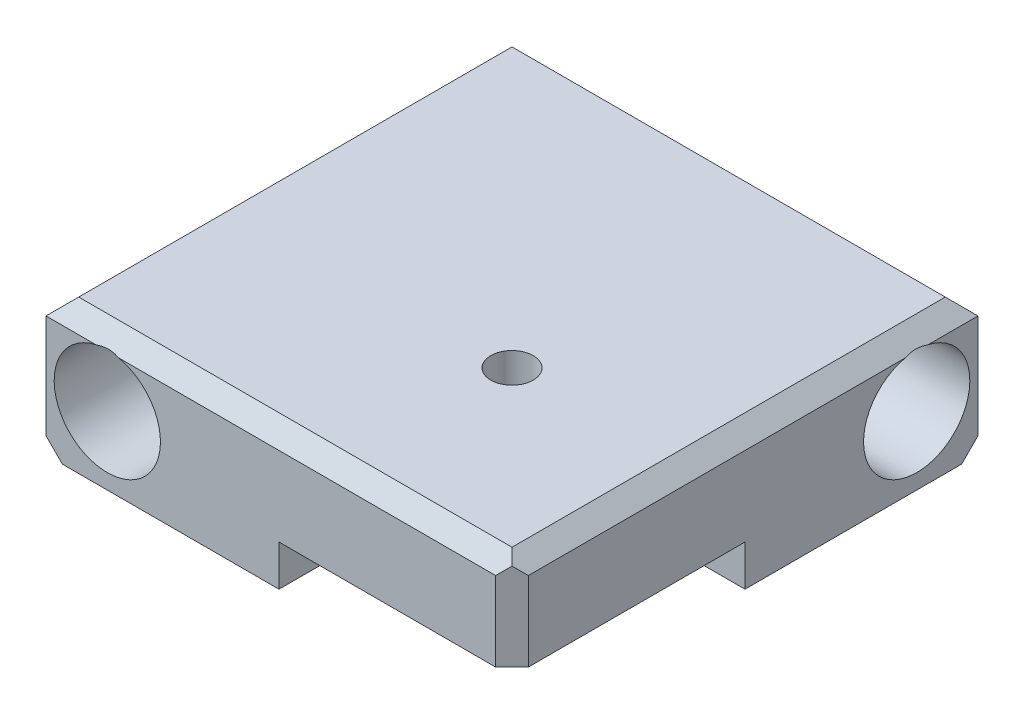
ISO-10303-21;
HEADER;
FILE_DESCRIPTION(('STEP AP214'),'2;1');
FILE_NAME('part.step','',(''),(''),'','','');
FILE_SCHEMA(('AUTOMOTIVE_DESIGN { 1 0 10303 214 1 1 1 1 }'));
ENDSEC;
DATA;
#1=APPLICATION_CONTEXT('core data for automotive mechanical design processes');
#2=APPLICATION_PROTOCOL_DEFINITION('international standard','automotive_design',2000,#1);
#3=PRODUCT_CONTEXT('',#1,'mechanical');
#4=PRODUCT('Part','Part','',(#3));
#5=PRODUCT_RELATED_PRODUCT_CATEGORY('part','',(#4));
#6=PRODUCT_DEFINITION_FORMATION('','',#4);
#7=PRODUCT_DEFINITION_CONTEXT('part definition',#1,'design');
#8=PRODUCT_DEFINITION('design','',#6,#7);
#9=PRODUCT_DEFINITION_SHAPE('','',#8);
#10=(LENGTH_UNIT() NAMED_UNIT(*) SI_UNIT(.MILLI.,.METRE.));
#11=(NAMED_UNIT(*) PLANE_ANGLE_UNIT() SI_UNIT($,.RADIAN.));
#12=(NAMED_UNIT(*) SI_UNIT($,.STERADIAN.) SOLID_ANGLE_UNIT());
#13=UNCERTAINTY_MEASURE_WITH_UNIT(LENGTH_MEASURE(1.E-05),#10,'distance_accuracy_value','');
#14=(GEOMETRIC_REPRESENTATION_CONTEXT(3) GLOBAL_UNCERTAINTY_ASSIGNED_CONTEXT((#13)) GLOBAL_UNIT_ASSIGNED_CONTEXT((#10,
#11,#12)) REPRESENTATION_CONTEXT('',''));
#15=CARTESIAN_POINT('',(0.,0.,0.));
#16=DIRECTION('',(0.,0.,1.));
#17=DIRECTION('',(1.,0.,0.));
#18=AXIS2_PLACEMENT_3D('',#15,#16,#17);
#19=CARTESIAN_POINT('',(28.5,-59.39696961967,16.));
#20=DIRECTION('',(0.,1.,0.));
#21=DIRECTION('',(0.,0.,1.));
#22=AXIS2_PLACEMENT_3D('',#19,#20,#21);
#23=CYLINDRICAL_SURFACE('',#22,2.6);
#24=CARTESIAN_POINT('',(28.5,16.7,16.));
#25=DIRECTION('',(0.,1.,0.));
#26=DIRECTION('',(0.,0.,1.));
#27=AXIS2_PLACEMENT_3D('',#24,#25,#26);
#28=CIRCLE('',#27,2.6);
#29=CARTESIAN_POINT('',(28.5,16.7,18.6));
#30=VERTEX_POINT('',#29);
#31=EDGE_CURVE('E244',#30,#30,#28,.T.);
#32=ORIENTED_EDGE('',*,*,#31,.T.);
#33=EDGE_LOOP('',(#32));
#34=FACE_BOUND('',#33,.T.);
#35=CARTESIAN_POINT('',(28.5,5.,16.));
#36=DIRECTION('',(0.,-1.,0.));
#37=DIRECTION('',(0.,0.,-1.));
#38=AXIS2_PLACEMENT_3D('',#35,#36,#37);
#39=CIRCLE('',#38,2.6);
#40=CARTESIAN_POINT('',(28.5,5.,13.4));
#41=VERTEX_POINT('',#40);
#42=EDGE_CURVE('E222',#41,#41,#39,.F.);
#43=ORIENTED_EDGE('',*,*,#42,.F.);
#44=EDGE_LOOP('',(#43));
#45=FACE_BOUND('',#44,.T.);
#46=ADVANCED_FACE('F55',(#34,#45),#23,.F.);
#47=CARTESIAN_POINT('',(47.5,-59.39696961967,37.));
#48=DIRECTION('',(-0.707106781186547,0.,-0.707106781186547));
#49=DIRECTION('',(0.,1.,0.));
#50=AXIS2_PLACEMENT_3D('',#47,#48,#49);
#51=PLANE('',#50);
#52=DIRECTION('',(0.,-1.,0.));
#53=VECTOR('',#52,1.);
#54=CARTESIAN_POINT('',(49.5,-59.39696961967,35.));
#55=LINE('',#54,#53);
#56=CARTESIAN_POINT('',(49.5,14.7,35.));
#57=VERTEX_POINT('',#56);
#58=CARTESIAN_POINT('',(49.5,5.,35.));
#59=VERTEX_POINT('',#58);
#60=EDGE_CURVE('E317',#57,#59,#55,.T.);
#61=ORIENTED_EDGE('',*,*,#60,.F.);
#62=DIRECTION('',(-0.577350269189625,0.577350269189627,0.577350269189625));
#63=VECTOR('',#62,1.);
#64=CARTESIAN_POINT('',(72.86565653989,-8.66565653989013,11.63434346011));
#65=LINE('',#64,#63);
#66=CARTESIAN_POINT('',(48.5,15.7,36.));
#67=VERTEX_POINT('',#66);
#68=EDGE_CURVE('E334',#57,#67,#65,.T.);
#69=ORIENTED_EDGE('',*,*,#68,.T.);
#70=DIRECTION('',(-0.577350269189625,-0.577350269189627,0.577350269189625));
#71=VECTOR('',#70,1.);
#72=CARTESIAN_POINT('',(22.8010101267766,-9.99898987322346,61.6989898732234));
#73=LINE('',#72,#71);
#74=CARTESIAN_POINT('',(47.5,14.7,37.));
#75=VERTEX_POINT('',#74);
#76=EDGE_CURVE('E332',#67,#75,#73,.T.);
#77=ORIENTED_EDGE('',*,*,#76,.T.);
#78=DIRECTION('',(0.,1.,0.));
#79=VECTOR('',#78,1.);
#80=CARTESIAN_POINT('',(47.5,-59.39696961967,37.));
#81=LINE('',#80,#79);
#82=CARTESIAN_POINT('',(47.5,5.,37.));
#83=VERTEX_POINT('',#82);
#84=EDGE_CURVE('E298',#83,#75,#81,.T.);
#85=ORIENTED_EDGE('',*,*,#84,.F.);
#86=DIRECTION('',(-0.707106781186547,0.,0.707106781186547));
#87=VECTOR('',#86,1.);
#88=CARTESIAN_POINT('',(49.5,5.,35.));
#89=LINE('',#88,#87);
#90=EDGE_CURVE('E213',#59,#83,#89,.T.);
#91=ORIENTED_EDGE('',*,*,#90,.F.);
#92=EDGE_LOOP('',(#61,#69,#77,#85,#91));
#93=FACE_BOUND('',#92,.T.);
#94=ADVANCED_FACE('F412',(#93),#51,.F.);
#95=CARTESIAN_POINT('',(0.,0.,0.));
#96=DIRECTION('',(0.,1.,0.));
#97=DIRECTION('',(0.,0.,1.));
#98=AXIS2_PLACEMENT_3D('',#95,#96,#97);
#99=PLANE('',#98);
#100=CARTESIAN_POINT('',(28.5,0.,16.));
#101=DIRECTION('',(0.,-1.,0.));
#102=DIRECTION('',(0.,0.,-1.));
#103=AXIS2_PLACEMENT_3D('',#100,#101,#102);
#104=CIRCLE('',#103,7.5);
#105=CARTESIAN_POINT('',(21.,0.,16.));
#106=VERTEX_POINT('',#105);
#107=CARTESIAN_POINT('',(28.5,0.,8.50000000000001));
#108=VERTEX_POINT('',#107);
#109=EDGE_CURVE('E188',#106,#108,#104,.T.);
#110=ORIENTED_EDGE('',*,*,#109,.F.);
#111=DIRECTION('',(0.,0.,-1.));
#112=VECTOR('',#111,1.);
#113=CARTESIAN_POINT('',(21.,0.,37.));
#114=LINE('',#113,#112);
#115=CARTESIAN_POINT('',(21.,0.,37.));
#116=VERTEX_POINT('',#115);
#117=EDGE_CURVE('E206',#116,#106,#114,.T.);
#118=ORIENTED_EDGE('',*,*,#117,.F.);
#119=DIRECTION('',(-1.,0.,0.));
#120=VECTOR('',#119,1.);
#121=CARTESIAN_POINT('',(0.,0.,37.));
#122=LINE('',#121,#120);
#123=CARTESIAN_POINT('',(-5.5,0.,37.));
#124=VERTEX_POINT('',#123);
#125=EDGE_CURVE('E248',#116,#124,#122,.T.);
#126=ORIENTED_EDGE('',*,*,#125,.T.);
#127=DIRECTION('',(0.,0.,-1.));
#128=VECTOR('',#127,1.);
#129=CARTESIAN_POINT('',(-5.49999999999999,0.,-20.));
#130=LINE('',#129,#128);
#131=CARTESIAN_POINT('',(-5.49999999999999,0.,-9.03589838486224));
#132=VERTEX_POINT('',#131);
#133=EDGE_CURVE('E273',#124,#132,#130,.T.);
#134=ORIENTED_EDGE('',*,*,#133,.T.);
#135=CARTESIAN_POINT('',(0.,0.,-12.5));
#136=DIRECTION('',(0.,-1.,0.));
#137=DIRECTION('',(0.,0.,-1.));
#138=AXIS2_PLACEMENT_3D('',#135,#136,#137);
#139=CIRCLE('',#138,6.5);
#140=CARTESIAN_POINT('',(3.46410161513776,0.,-18.));
#141=VERTEX_POINT('',#140);
#142=EDGE_CURVE('E254',#141,#132,#139,.T.);
#143=ORIENTED_EDGE('',*,*,#142,.F.);
#144=DIRECTION('',(1.,0.,0.));
#145=VECTOR('',#144,1.);
#146=CARTESIAN_POINT('',(17.5,0.,-18.));
#147=LINE('',#146,#145);
#148=CARTESIAN_POINT('',(49.5,0.,-18.));
#149=VERTEX_POINT('',#148);
#150=EDGE_CURVE('E267',#141,#149,#147,.T.);
#151=ORIENTED_EDGE('',*,*,#150,.T.);
#152=DIRECTION('',(0.,0.,1.));
#153=VECTOR('',#152,1.);
#154=CARTESIAN_POINT('',(49.5,0.,0.));
#155=LINE('',#154,#153);
#156=CARTESIAN_POINT('',(49.5,0.,8.50000000000001));
#157=VERTEX_POINT('',#156);
#158=EDGE_CURVE('E249',#149,#157,#155,.T.);
#159=ORIENTED_EDGE('',*,*,#158,.T.);
#160=DIRECTION('',(1.,0.,0.));
#161=VECTOR('',#160,1.);
#162=CARTESIAN_POINT('',(28.5,0.,8.50000000000001));
#163=LINE('',#162,#161);
#164=EDGE_CURVE('E209',#108,#157,#163,.T.);
#165=ORIENTED_EDGE('',*,*,#164,.F.);
#166=EDGE_LOOP('',(#110,#118,#126,#134,#143,#151,#159,#165));
#167=FACE_BOUND('',#166,.T.);
#168=ADVANCED_FACE('F398',(#167),#99,.F.);
#169=CARTESIAN_POINT('',(-7.5,16.7,0.));
#170=DIRECTION('',(-1.,0.,0.));
#171=DIRECTION('',(0.,0.,1.));
#172=AXIS2_PLACEMENT_3D('',#169,#170,#171);
#173=PLANE('',#172);
#174=DIRECTION('',(0.,-1.,0.));
#175=VECTOR('',#174,1.);
#176=CARTESIAN_POINT('',(-7.49999999999999,16.7,-18.));
#177=LINE('',#176,#175);
#178=CARTESIAN_POINT('',(-7.49999999999999,14.7,-18.));
#179=VERTEX_POINT('',#178);
#180=CARTESIAN_POINT('',(-7.49999999999999,2.,-18.));
#181=VERTEX_POINT('',#180);
#182=EDGE_CURVE('E280',#179,#181,#177,.T.);
#183=ORIENTED_EDGE('',*,*,#182,.T.);
#184=DIRECTION('',(0.,0.,1.));
#185=VECTOR('',#184,1.);
#186=CARTESIAN_POINT('',(-7.5,2.,5.));
#187=LINE('',#186,#185);
#188=CARTESIAN_POINT('',(-7.5,2.,37.));
#189=VERTEX_POINT('',#188);
#190=EDGE_CURVE('E284',#181,#189,#187,.T.);
#191=ORIENTED_EDGE('',*,*,#190,.T.);
#192=DIRECTION('',(0.,-1.,0.));
#193=VECTOR('',#192,1.);
#194=CARTESIAN_POINT('',(-7.5,14.7,37.));
#195=LINE('',#194,#193);
#196=CARTESIAN_POINT('',(-7.5,14.7,37.));
#197=VERTEX_POINT('',#196);
#198=EDGE_CURVE('E241',#197,#189,#195,.T.);
#199=ORIENTED_EDGE('',*,*,#198,.F.);
#200=DIRECTION('',(0.,0.,-1.));
#201=VECTOR('',#200,1.);
#202=CARTESIAN_POINT('',(-7.5,14.7,0.));
#203=LINE('',#202,#201);
#204=EDGE_CURVE('E282',#197,#179,#203,.T.);
#205=ORIENTED_EDGE('',*,*,#204,.T.);
#206=EDGE_LOOP('',(#183,#191,#199,#205));
#207=FACE_BOUND('',#206,.T.);
#208=ADVANCED_FACE('F351',(#207),#173,.T.);
#209=CARTESIAN_POINT('',(0.,16.7,-20.));
#210=DIRECTION('',(0.,0.,-1.));
#211=DIRECTION('',(-1.,0.,0.));
#212=AXIS2_PLACEMENT_3D('',#209,#210,#211);
#213=PLANE('',#212);
#214=DIRECTION('',(0.,1.,0.));
#215=VECTOR('',#214,1.);
#216=CARTESIAN_POINT('',(-5.49999999999999,16.7,-20.));
#217=LINE('',#216,#215);
#218=CARTESIAN_POINT('',(-5.49999999999999,2.,-20.));
#219=VERTEX_POINT('',#218);
#220=CARTESIAN_POINT('',(-5.49999999999999,14.7,-20.));
#221=VERTEX_POINT('',#220);
#222=EDGE_CURVE('E291',#219,#221,#217,.T.);
#223=ORIENTED_EDGE('',*,*,#222,.T.);
#224=DIRECTION('',(1.,0.,0.));
#225=VECTOR('',#224,1.);
#226=CARTESIAN_POINT('',(0.,14.7,-20.));
#227=LINE('',#226,#225);
#228=CARTESIAN_POINT('',(49.5,14.7,-20.));
#229=VERTEX_POINT('',#228);
#230=EDGE_CURVE('E295',#221,#229,#227,.T.);
#231=ORIENTED_EDGE('',*,*,#230,.T.);
#232=DIRECTION('',(0.,1.,0.));
#233=VECTOR('',#232,1.);
#234=CARTESIAN_POINT('',(49.5,2.,-20.));
#235=LINE('',#234,#233);
#236=CARTESIAN_POINT('',(49.5,2.,-20.));
#237=VERTEX_POINT('',#236);
#238=EDGE_CURVE('E229',#237,#229,#235,.T.);
#239=ORIENTED_EDGE('',*,*,#238,.F.);
#240=DIRECTION('',(-1.,0.,0.));
#241=VECTOR('',#240,1.);
#242=CARTESIAN_POINT('',(-7.5,2.,-20.));
#243=LINE('',#242,#241);
#244=EDGE_CURVE('E293',#237,#219,#243,.T.);
#245=ORIENTED_EDGE('',*,*,#244,.T.);
#246=EDGE_LOOP('',(#223,#231,#239,#245));
#247=FACE_BOUND('',#246,.T.);
#248=ADVANCED_FACE('F420',(#247),#213,.T.);
#249=CARTESIAN_POINT('',(0.,16.7,0.));
#250=DIRECTION('',(0.,1.,0.));
#251=DIRECTION('',(0.,0.,1.));
#252=AXIS2_PLACEMENT_3D('',#249,#250,#251);
#253=PLANE('',#252);
#254=DIRECTION('',(1.,0.,0.));
#255=VECTOR('',#254,1.);
#256=CARTESIAN_POINT('',(0.,16.7,35.));
#257=LINE('',#256,#255);
#258=CARTESIAN_POINT('',(-5.5,16.7,35.));
#259=VERTEX_POINT('',#258);
#260=CARTESIAN_POINT('',(47.5,16.7,35.));
#261=VERTEX_POINT('',#260);
#262=EDGE_CURVE('E319',#259,#261,#257,.T.);
#263=ORIENTED_EDGE('',*,*,#262,.T.);
#264=DIRECTION('',(0.,0.,-1.));
#265=VECTOR('',#264,1.);
#266=CARTESIAN_POINT('',(47.5,16.7,0.));
#267=LINE('',#266,#265);
#268=CARTESIAN_POINT('',(47.5,16.7,-18.));
#269=VERTEX_POINT('',#268);
#270=EDGE_CURVE('E321',#261,#269,#267,.T.);
#271=ORIENTED_EDGE('',*,*,#270,.T.);
#272=DIRECTION('',(-1.,0.,0.));
#273=VECTOR('',#272,1.);
#274=CARTESIAN_POINT('',(0.,16.7,-18.));
#275=LINE('',#274,#273);
#276=CARTESIAN_POINT('',(-5.49999999999999,16.7,-18.));
#277=VERTEX_POINT('',#276);
#278=EDGE_CURVE('E286',#269,#277,#275,.T.);
#279=ORIENTED_EDGE('',*,*,#278,.T.);
#280=DIRECTION('',(0.,0.,1.));
#281=VECTOR('',#280,1.);
#282=CARTESIAN_POINT('',(-5.49999999999999,16.7,0.));
#283=LINE('',#282,#281);
#284=EDGE_CURVE('E288',#277,#259,#283,.T.);
#285=ORIENTED_EDGE('',*,*,#284,.T.);
#286=EDGE_LOOP('',(#263,#271,#279,#285));
#287=FACE_BOUND('',#286,.T.);
#288=ORIENTED_EDGE('',*,*,#31,.F.);
#289=EDGE_LOOP('',(#288));
#290=FACE_BOUND('',#289,.T.);
#291=ADVANCED_FACE('F360',(#287,#290),#253,.T.);
#292=CARTESIAN_POINT('',(-5.49999999999999,0.,-15.9641016151378));
#293=VERTEX_POINT('',#292);
#294=CARTESIAN_POINT('',(-3.46410161513776,0.,-18.));
#295=VERTEX_POINT('',#294);
#296=EDGE_CURVE('E258',#293,#295,#139,.T.);
#297=ORIENTED_EDGE('',*,*,#296,.F.);
#298=DIRECTION('',(0.,0.,-1.));
#299=VECTOR('',#298,1.);
#300=CARTESIAN_POINT('',(-5.49999999999999,0.,-20.));
#301=LINE('',#300,#299);
#302=CARTESIAN_POINT('',(-5.49999999999999,0.,-18.));
#303=VERTEX_POINT('',#302);
#304=EDGE_CURVE('E271',#293,#303,#301,.T.);
#305=ORIENTED_EDGE('',*,*,#304,.T.);
#306=DIRECTION('',(1.,0.,0.));
#307=VECTOR('',#306,1.);
#308=CARTESIAN_POINT('',(17.5,0.,-18.));
#309=LINE('',#308,#307);
#310=EDGE_CURVE('E269',#303,#295,#309,.T.);
#311=ORIENTED_EDGE('',*,*,#310,.T.);
#312=EDGE_LOOP('',(#297,#305,#311));
#313=FACE_BOUND('',#312,.T.);
#314=ADVANCED_FACE('F392',(#313),#99,.F.);
#315=CARTESIAN_POINT('',(0.,14.7,0.));
#316=DIRECTION('',(0.,1.,0.));
#317=DIRECTION('',(0.,0.,1.));
#318=AXIS2_PLACEMENT_3D('',#315,#316,#317);
#319=PLANE('',#318);
#320=CARTESIAN_POINT('',(0.,14.7,-12.5));
#321=DIRECTION('',(0.,1.,0.));
#322=DIRECTION('',(0.,0.,1.));
#323=AXIS2_PLACEMENT_3D('',#320,#321,#322);
#324=CIRCLE('',#323,6.5);
#325=CARTESIAN_POINT('',(0.,14.7,-6.00000000000001));
#326=VERTEX_POINT('',#325);
#327=EDGE_CURVE('E257',#326,#326,#324,.F.);
#328=ORIENTED_EDGE('',*,*,#327,.T.);
#329=EDGE_LOOP('',(#328));
#330=FACE_BOUND('',#329,.T.);
#331=ADVANCED_FACE('F459',(#330),#319,.F.);
#332=CARTESIAN_POINT('',(0.,35.0847763108502,-12.5));
#333=DIRECTION('',(0.,-1.,0.));
#334=DIRECTION('',(0.,0.,-1.));
#335=AXIS2_PLACEMENT_3D('',#332,#333,#334);
#336=CYLINDRICAL_SURFACE('',#335,6.5);
#337=ORIENTED_EDGE('',*,*,#142,.T.);
#338=CARTESIAN_POINT('',(0.,-5.49999999999999,-12.5));
#339=DIRECTION('',(-0.707106781186547,-0.707106781186548,0.));
#340=DIRECTION('',(0.707106781186548,-0.707106781186547,0.));
#341=AXIS2_PLACEMENT_3D('',#338,#339,#340);
#342=ELLIPSE('',#341,9.19238815542512,6.5);
#343=EDGE_CURVE('E278',#132,#293,#342,.T.);
#344=ORIENTED_EDGE('',*,*,#343,.T.);
#345=ORIENTED_EDGE('',*,*,#296,.T.);
#346=CARTESIAN_POINT('',(0.,-5.5,-12.5));
#347=DIRECTION('',(0.,-0.707106781186547,-0.707106781186548));
#348=DIRECTION('',(0.,-0.707106781186548,0.707106781186547));
#349=AXIS2_PLACEMENT_3D('',#346,#347,#348);
#350=ELLIPSE('',#349,9.19238815542512,6.5);
#351=EDGE_CURVE('E276',#295,#141,#350,.T.);
#352=ORIENTED_EDGE('',*,*,#351,.T.);
#353=EDGE_LOOP('',(#337,#344,#345,#352));
#354=FACE_BOUND('',#353,.T.);
#355=ORIENTED_EDGE('',*,*,#327,.F.);
#356=EDGE_LOOP('',(#355));
#357=FACE_BOUND('',#356,.T.);
#358=ADVANCED_FACE('F394',(#354,#357),#336,.F.);
#359=CARTESIAN_POINT('',(0.,14.7,-20.));
#360=DIRECTION('',(0.,-0.707106781186547,0.707106781186548));
#361=DIRECTION('',(1.,0.,0.));
#362=AXIS2_PLACEMENT_3D('',#359,#360,#361);
#363=PLANE('',#362);
#364=ORIENTED_EDGE('',*,*,#278,.F.);
#365=DIRECTION('',(0.577350269189625,-0.577350269189627,-0.577350269189626));
#366=VECTOR('',#365,1.);
#367=CARTESIAN_POINT('',(33.0000000000001,31.2,-3.50000000000002));
#368=LINE('',#367,#366);
#369=EDGE_CURVE('E324',#269,#229,#368,.T.);
#370=ORIENTED_EDGE('',*,*,#369,.T.);
#371=ORIENTED_EDGE('',*,*,#230,.F.);
#372=DIRECTION('',(0.,0.707106781186548,0.707106781186547));
#373=VECTOR('',#372,1.);
#374=CARTESIAN_POINT('',(-5.49999999999999,15.7,-19.));
#375=LINE('',#374,#373);
#376=EDGE_CURVE('E313',#277,#221,#375,.F.);
#377=ORIENTED_EDGE('',*,*,#376,.F.);
#378=EDGE_LOOP('',(#364,#370,#371,#377));
#379=FACE_BOUND('',#378,.T.);
#380=ADVANCED_FACE('F366',(#379),#363,.F.);
#381=CARTESIAN_POINT('',(-7.5,14.7,0.));
#382=DIRECTION('',(0.707106781186547,-0.707106781186548,0.));
#383=DIRECTION('',(0.,0.,-1.));
#384=AXIS2_PLACEMENT_3D('',#381,#382,#383);
#385=PLANE('',#384);
#386=ORIENTED_EDGE('',*,*,#204,.F.);
#387=DIRECTION('',(0.577350269189627,0.577350269189626,-0.577350269189624));
#388=VECTOR('',#387,1.);
#389=CARTESIAN_POINT('',(4.83333333333332,27.0333333333333,24.6666666666667));
#390=LINE('',#389,#388);
#391=EDGE_CURVE('E14',#197,#259,#390,.T.);
#392=ORIENTED_EDGE('',*,*,#391,.T.);
#393=ORIENTED_EDGE('',*,*,#284,.F.);
#394=DIRECTION('',(-0.707106781186548,-0.707106781186547,0.));
#395=VECTOR('',#394,1.);
#396=CARTESIAN_POINT('',(-7.49999999999999,14.7,-18.));
#397=LINE('',#396,#395);
#398=EDGE_CURVE('E310',#179,#277,#397,.F.);
#399=ORIENTED_EDGE('',*,*,#398,.F.);
#400=EDGE_LOOP('',(#386,#392,#393,#399));
#401=FACE_BOUND('',#400,.T.);
#402=ADVANCED_FACE('F347',(#401),#385,.F.);
#403=CARTESIAN_POINT('',(-7.49999999999999,14.7,-18.));
#404=DIRECTION('',(-0.577350269189626,0.577350269189626,-0.577350269189626));
#405=DIRECTION('',(0.,0.707106781186548,0.707106781186547));
#406=AXIS2_PLACEMENT_3D('',#403,#404,#405);
#407=PLANE('',#406);
#408=ORIENTED_EDGE('',*,*,#398,.T.);
#409=ORIENTED_EDGE('',*,*,#376,.T.);
#410=DIRECTION('',(0.707106781186548,0.,-0.707106781186547));
#411=VECTOR('',#410,1.);
#412=CARTESIAN_POINT('',(-7.49999999999999,14.7,-18.));
#413=LINE('',#412,#411);
#414=EDGE_CURVE('E307',#179,#221,#413,.T.);
#415=ORIENTED_EDGE('',*,*,#414,.F.);
#416=EDGE_LOOP('',(#408,#409,#415));
#417=FACE_BOUND('',#416,.T.);
#418=ADVANCED_FACE('F368',(#417),#407,.T.);
#419=CARTESIAN_POINT('',(0.,0.,-18.));
#420=DIRECTION('',(0.,-0.707106781186547,-0.707106781186548));
#421=DIRECTION('',(-1.,0.,0.));
#422=AXIS2_PLACEMENT_3D('',#419,#420,#421);
#423=PLANE('',#422);
#424=ORIENTED_EDGE('',*,*,#351,.F.);
#425=ORIENTED_EDGE('',*,*,#310,.F.);
#426=DIRECTION('',(0.,-0.707106781186548,0.707106781186547));
#427=VECTOR('',#426,1.);
#428=CARTESIAN_POINT('',(-5.49999999999999,0.,-18.));
#429=LINE('',#428,#427);
#430=EDGE_CURVE('E304',#219,#303,#429,.T.);
#431=ORIENTED_EDGE('',*,*,#430,.F.);
#432=ORIENTED_EDGE('',*,*,#244,.F.);
#433=DIRECTION('',(0.,0.707106781186547,-0.707106781186548));
#434=VECTOR('',#433,1.);
#435=CARTESIAN_POINT('',(49.5,0.,-18.));
#436=LINE('',#435,#434);
#437=EDGE_CURVE('E232',#149,#237,#436,.T.);
#438=ORIENTED_EDGE('',*,*,#437,.F.);
#439=ORIENTED_EDGE('',*,*,#150,.F.);
#440=EDGE_LOOP('',(#424,#425,#431,#432,#438,#439));
#441=FACE_BOUND('',#440,.T.);
#442=ADVANCED_FACE('F385',(#441),#423,.T.);
#443=CARTESIAN_POINT('',(-7.49999999999999,16.7,-18.));
#444=DIRECTION('',(0.707106781186547,0.,0.707106781186548));
#445=DIRECTION('',(0.,-1.,0.));
#446=AXIS2_PLACEMENT_3D('',#443,#444,#445);
#447=PLANE('',#446);
#448=ORIENTED_EDGE('',*,*,#414,.T.);
#449=ORIENTED_EDGE('',*,*,#222,.F.);
#450=DIRECTION('',(-0.707106781186548,0.,0.707106781186547));
#451=VECTOR('',#450,1.);
#452=CARTESIAN_POINT('',(-6.49999999999999,2.,-19.));
#453=LINE('',#452,#451);
#454=EDGE_CURVE('E301',#181,#219,#453,.F.);
#455=ORIENTED_EDGE('',*,*,#454,.F.);
#456=ORIENTED_EDGE('',*,*,#182,.F.);
#457=EDGE_LOOP('',(#448,#449,#455,#456));
#458=FACE_BOUND('',#457,.T.);
#459=ADVANCED_FACE('F373',(#458),#447,.F.);
#460=CARTESIAN_POINT('',(-5.49999999999999,0.,-18.));
#461=DIRECTION('',(-0.577350269189626,-0.577350269189626,-0.577350269189626));
#462=DIRECTION('',(0.,0.707106781186548,-0.707106781186547));
#463=AXIS2_PLACEMENT_3D('',#460,#461,#462);
#464=PLANE('',#463);
#465=ORIENTED_EDGE('',*,*,#454,.T.);
#466=ORIENTED_EDGE('',*,*,#430,.T.);
#467=DIRECTION('',(-0.707106781186548,0.707106781186547,0.));
#468=VECTOR('',#467,1.);
#469=CARTESIAN_POINT('',(-5.49999999999999,0.,-18.));
#470=LINE('',#469,#468);
#471=EDGE_CURVE('E252',#181,#303,#470,.F.);
#472=ORIENTED_EDGE('',*,*,#471,.F.);
#473=EDGE_LOOP('',(#465,#466,#472));
#474=FACE_BOUND('',#473,.T.);
#475=ADVANCED_FACE('F381',(#474),#464,.T.);
#476=CARTESIAN_POINT('',(-5.49999999999999,0.,0.));
#477=DIRECTION('',(-0.707106781186547,-0.707106781186548,0.));
#478=DIRECTION('',(0.,0.,1.));
#479=AXIS2_PLACEMENT_3D('',#476,#477,#478);
#480=PLANE('',#479);
#481=ORIENTED_EDGE('',*,*,#133,.F.);
#482=DIRECTION('',(0.707106781186548,-0.707106781186547,0.));
#483=VECTOR('',#482,1.);
#484=CARTESIAN_POINT('',(-7.5,2.,37.));
#485=LINE('',#484,#483);
#486=EDGE_CURVE('E238',#189,#124,#485,.T.);
#487=ORIENTED_EDGE('',*,*,#486,.F.);
#488=ORIENTED_EDGE('',*,*,#190,.F.);
#489=ORIENTED_EDGE('',*,*,#471,.T.);
#490=ORIENTED_EDGE('',*,*,#304,.F.);
#491=ORIENTED_EDGE('',*,*,#343,.F.);
#492=EDGE_LOOP('',(#481,#487,#488,#489,#490,#491));
#493=FACE_BOUND('',#492,.T.);
#494=ADVANCED_FACE('F379',(#493),#480,.T.);
#495=CARTESIAN_POINT('',(0.,-59.39696961967,37.));
#496=DIRECTION('',(0.,0.,1.));
#497=DIRECTION('',(1.,0.,0.));
#498=AXIS2_PLACEMENT_3D('',#495,#496,#497);
#499=PLANE('',#498);
#500=ORIENTED_EDGE('',*,*,#84,.T.);
#501=DIRECTION('',(-1.,0.,0.));
#502=VECTOR('',#501,1.);
#503=CARTESIAN_POINT('',(0.,14.7,37.));
#504=LINE('',#503,#502);
#505=CARTESIAN_POINT('',(1.3883443376915,14.7,37.));
#506=VERTEX_POINT('',#505);
#507=EDGE_CURVE('E77',#75,#506,#504,.T.);
#508=ORIENTED_EDGE('',*,*,#507,.T.);
#509=CARTESIAN_POINT('',(0.,8.35,37.));
#510=DIRECTION('',(0.,0.,1.));
#511=DIRECTION('',(1.,0.,0.));
#512=AXIS2_PLACEMENT_3D('',#509,#510,#511);
#513=CIRCLE('',#512,6.5);
#514=CARTESIAN_POINT('',(-1.3883443376915,14.7,37.));
#515=VERTEX_POINT('',#514);
#516=EDGE_CURVE('E235',#515,#506,#513,.T.);
#517=ORIENTED_EDGE('',*,*,#516,.F.);
#518=DIRECTION('',(-1.,0.,0.));
#519=VECTOR('',#518,1.);
#520=CARTESIAN_POINT('',(0.,14.7,37.));
#521=LINE('',#520,#519);
#522=EDGE_CURVE('E336',#515,#197,#521,.T.);
#523=ORIENTED_EDGE('',*,*,#522,.T.);
#524=ORIENTED_EDGE('',*,*,#198,.T.);
#525=ORIENTED_EDGE('',*,*,#486,.T.);
#526=ORIENTED_EDGE('',*,*,#125,.F.);
#527=DIRECTION('',(0.,-1.,0.));
#528=VECTOR('',#527,1.);
#529=CARTESIAN_POINT('',(21.,5.,37.));
#530=LINE('',#529,#528);
#531=CARTESIAN_POINT('',(21.,5.,37.));
#532=VERTEX_POINT('',#531);
#533=EDGE_CURVE('E223',#532,#116,#530,.T.);
#534=ORIENTED_EDGE('',*,*,#533,.F.);
#535=DIRECTION('',(-1.,0.,0.));
#536=VECTOR('',#535,1.);
#537=CARTESIAN_POINT('',(47.5,5.,37.));
#538=LINE('',#537,#536);
#539=EDGE_CURVE('E215',#83,#532,#538,.T.);
#540=ORIENTED_EDGE('',*,*,#539,.F.);
#541=EDGE_LOOP('',(#500,#508,#517,#523,#524,#525,#526,#534,#540));
#542=FACE_BOUND('',#541,.T.);
#543=ADVANCED_FACE('F341',(#542),#499,.T.);
#544=CARTESIAN_POINT('',(49.5,-59.39696961967,0.));
#545=DIRECTION('',(1.,0.,0.));
#546=DIRECTION('',(0.,0.,-1.));
#547=AXIS2_PLACEMENT_3D('',#544,#545,#546);
#548=PLANE('',#547);
#549=ORIENTED_EDGE('',*,*,#238,.T.);
#550=DIRECTION('',(0.,0.,1.));
#551=VECTOR('',#550,1.);
#552=CARTESIAN_POINT('',(49.5,14.7,0.));
#553=LINE('',#552,#551);
#554=CARTESIAN_POINT('',(49.5,14.7,-13.8883443376915));
#555=VERTEX_POINT('',#554);
#556=EDGE_CURVE('E328',#229,#555,#553,.T.);
#557=ORIENTED_EDGE('',*,*,#556,.T.);
#558=CARTESIAN_POINT('',(49.5,8.35,-12.5));
#559=DIRECTION('',(1.,0.,0.));
#560=DIRECTION('',(0.,0.,-1.));
#561=AXIS2_PLACEMENT_3D('',#558,#559,#560);
#562=CIRCLE('',#561,6.5);
#563=CARTESIAN_POINT('',(49.5,14.7,-11.1116556623085));
#564=VERTEX_POINT('',#563);
#565=EDGE_CURVE('E228',#564,#555,#562,.T.);
#566=ORIENTED_EDGE('',*,*,#565,.F.);
#567=DIRECTION('',(0.,0.,1.));
#568=VECTOR('',#567,1.);
#569=CARTESIAN_POINT('',(49.5,14.7,0.));
#570=LINE('',#569,#568);
#571=EDGE_CURVE('E326',#564,#57,#570,.T.);
#572=ORIENTED_EDGE('',*,*,#571,.T.);
#573=ORIENTED_EDGE('',*,*,#60,.T.);
#574=DIRECTION('',(0.,0.,1.));
#575=VECTOR('',#574,1.);
#576=CARTESIAN_POINT('',(49.5,5.,8.50000000000001));
#577=LINE('',#576,#575);
#578=CARTESIAN_POINT('',(49.5,5.,8.50000000000001));
#579=VERTEX_POINT('',#578);
#580=EDGE_CURVE('E201',#579,#59,#577,.T.);
#581=ORIENTED_EDGE('',*,*,#580,.F.);
#582=DIRECTION('',(0.,-1.,0.));
#583=VECTOR('',#582,1.);
#584=CARTESIAN_POINT('',(49.5,5.,8.50000000000001));
#585=LINE('',#584,#583);
#586=EDGE_CURVE('E191',#579,#157,#585,.T.);
#587=ORIENTED_EDGE('',*,*,#586,.T.);
#588=ORIENTED_EDGE('',*,*,#158,.F.);
#589=ORIENTED_EDGE('',*,*,#437,.T.);
#590=EDGE_LOOP('',(#549,#557,#566,#572,#573,#581,#587,#588,#589));
#591=FACE_BOUND('',#590,.T.);
#592=ADVANCED_FACE('F408',(#591),#548,.T.);
#593=CARTESIAN_POINT('',(0.,16.7,-3.3));
#594=DIRECTION('',(0.,0.,-1.));
#595=DIRECTION('',(-1.,0.,0.));
#596=AXIS2_PLACEMENT_3D('',#593,#594,#595);
#597=PLANE('',#596);
#598=CARTESIAN_POINT('',(0.,8.35,-3.3));
#599=DIRECTION('',(0.,0.,-1.));
#600=DIRECTION('',(-1.,0.,0.));
#601=AXIS2_PLACEMENT_3D('',#598,#599,#600);
#602=CIRCLE('',#601,6.5);
#603=CARTESIAN_POINT('',(-6.5,8.35,-3.3));
#604=VERTEX_POINT('',#603);
#605=EDGE_CURVE('E264',#604,#604,#602,.F.);
#606=ORIENTED_EDGE('',*,*,#605,.T.);
#607=EDGE_LOOP('',(#606));
#608=FACE_BOUND('',#607,.T.);
#609=ADVANCED_FACE('F455',(#608),#597,.F.);
#610=CARTESIAN_POINT('',(0.,8.35,-38.3847763108502));
#611=DIRECTION('',(0.,0.,1.));
#612=DIRECTION('',(1.,0.,0.));
#613=AXIS2_PLACEMENT_3D('',#610,#611,#612);
#614=CYLINDRICAL_SURFACE('',#613,6.5);
#615=ORIENTED_EDGE('',*,*,#605,.F.);
#616=EDGE_LOOP('',(#615));
#617=FACE_BOUND('',#616,.T.);
#618=ORIENTED_EDGE('',*,*,#516,.T.);
#619=CARTESIAN_POINT('',(0.,8.35,43.35));
#620=DIRECTION('',(0.,-0.707106781186546,-0.707106781186549));
#621=DIRECTION('',(0.,-0.707106781186549,0.707106781186546));
#622=AXIS2_PLACEMENT_3D('',#619,#620,#621);
#623=ELLIPSE('',#622,9.1923881554251,6.5);
#624=EDGE_CURVE('E65',#506,#515,#623,.F.);
#625=ORIENTED_EDGE('',*,*,#624,.T.);
#626=EDGE_LOOP('',(#618,#625));
#627=FACE_BOUND('',#626,.T.);
#628=ADVANCED_FACE('F435',(#617,#627),#614,.F.);
#629=CARTESIAN_POINT('',(9.2,16.7,0.));
#630=DIRECTION('',(-1.,0.,0.));
#631=DIRECTION('',(0.,0.,1.));
#632=AXIS2_PLACEMENT_3D('',#629,#630,#631);
#633=PLANE('',#632);
#634=CARTESIAN_POINT('',(9.2,8.35,-12.5));
#635=DIRECTION('',(-1.,0.,0.));
#636=DIRECTION('',(0.,0.,1.));
#637=AXIS2_PLACEMENT_3D('',#634,#635,#636);
#638=CIRCLE('',#637,6.5);
#639=CARTESIAN_POINT('',(9.2,8.35,-6.));
#640=VERTEX_POINT('',#639);
#641=EDGE_CURVE('E261',#640,#640,#638,.F.);
#642=ORIENTED_EDGE('',*,*,#641,.T.);
#643=EDGE_LOOP('',(#642));
#644=FACE_BOUND('',#643,.T.);
#645=ADVANCED_FACE('F425',(#644),#633,.F.);
#646=CARTESIAN_POINT('',(-25.8847763108502,8.35,-12.5));
#647=DIRECTION('',(1.,0.,0.));
#648=DIRECTION('',(0.,0.,-1.));
#649=AXIS2_PLACEMENT_3D('',#646,#647,#648);
#650=CYLINDRICAL_SURFACE('',#649,6.5);
#651=ORIENTED_EDGE('',*,*,#641,.F.);
#652=EDGE_LOOP('',(#651));
#653=FACE_BOUND('',#652,.T.);
#654=ORIENTED_EDGE('',*,*,#565,.T.);
#655=CARTESIAN_POINT('',(55.85,8.35,-12.5));
#656=DIRECTION('',(-0.707106781186549,-0.707106781186546,0.));
#657=DIRECTION('',(0.707106781186546,-0.707106781186549,0.));
#658=AXIS2_PLACEMENT_3D('',#655,#656,#657);
#659=ELLIPSE('',#658,9.19238815542511,6.5);
#660=EDGE_CURVE('E330',#555,#564,#659,.F.);
#661=ORIENTED_EDGE('',*,*,#660,.T.);
#662=EDGE_LOOP('',(#654,#661));
#663=FACE_BOUND('',#662,.T.);
#664=ADVANCED_FACE('F423',(#653,#663),#650,.F.);
#665=CARTESIAN_POINT('',(28.5,5.,16.));
#666=DIRECTION('',(0.,-1.,0.));
#667=DIRECTION('',(0.,0.,-1.));
#668=AXIS2_PLACEMENT_3D('',#665,#666,#667);
#669=PLANE('',#668);
#670=CARTESIAN_POINT('',(28.5,5.,16.));
#671=DIRECTION('',(0.,-1.,0.));
#672=DIRECTION('',(0.,0.,-1.));
#673=AXIS2_PLACEMENT_3D('',#670,#671,#672);
#674=CIRCLE('',#673,7.5);
#675=CARTESIAN_POINT('',(21.,5.,16.));
#676=VERTEX_POINT('',#675);
#677=CARTESIAN_POINT('',(28.5,5.,8.50000000000001));
#678=VERTEX_POINT('',#677);
#679=EDGE_CURVE('E185',#676,#678,#674,.T.);
#680=ORIENTED_EDGE('',*,*,#679,.T.);
#681=DIRECTION('',(1.,0.,0.));
#682=VECTOR('',#681,1.);
#683=CARTESIAN_POINT('',(28.5,5.,8.50000000000001));
#684=LINE('',#683,#682);
#685=EDGE_CURVE('E195',#678,#579,#684,.T.);
#686=ORIENTED_EDGE('',*,*,#685,.T.);
#687=ORIENTED_EDGE('',*,*,#580,.T.);
#688=ORIENTED_EDGE('',*,*,#90,.T.);
#689=ORIENTED_EDGE('',*,*,#539,.T.);
#690=DIRECTION('',(0.,0.,-1.));
#691=VECTOR('',#690,1.);
#692=CARTESIAN_POINT('',(21.,5.,37.));
#693=LINE('',#692,#691);
#694=EDGE_CURVE('E192',#532,#676,#693,.T.);
#695=ORIENTED_EDGE('',*,*,#694,.T.);
#696=EDGE_LOOP('',(#680,#686,#687,#688,#689,#695));
#697=FACE_BOUND('',#696,.T.);
#698=ORIENTED_EDGE('',*,*,#42,.T.);
#699=EDGE_LOOP('',(#698));
#700=FACE_BOUND('',#699,.T.);
#701=ADVANCED_FACE('F203',(#697,#700),#669,.T.);
#702=CARTESIAN_POINT('',(28.5,5.,16.));
#703=DIRECTION('',(0.,-1.,0.));
#704=DIRECTION('',(0.,0.,-1.));
#705=AXIS2_PLACEMENT_3D('',#702,#703,#704);
#706=CYLINDRICAL_SURFACE('',#705,7.5);
#707=ORIENTED_EDGE('',*,*,#109,.T.);
#708=DIRECTION('',(0.,-1.,0.));
#709=VECTOR('',#708,1.);
#710=CARTESIAN_POINT('',(28.5,5.,8.50000000000001));
#711=LINE('',#710,#709);
#712=EDGE_CURVE('E181',#678,#108,#711,.T.);
#713=ORIENTED_EDGE('',*,*,#712,.F.);
#714=ORIENTED_EDGE('',*,*,#679,.F.);
#715=DIRECTION('',(0.,-1.,0.));
#716=VECTOR('',#715,1.);
#717=CARTESIAN_POINT('',(21.,5.,16.));
#718=LINE('',#717,#716);
#719=EDGE_CURVE('E220',#676,#106,#718,.T.);
#720=ORIENTED_EDGE('',*,*,#719,.T.);
#721=EDGE_LOOP('',(#707,#713,#714,#720));
#722=FACE_BOUND('',#721,.T.);
#723=ADVANCED_FACE('F183',(#722),#706,.F.);
#724=CARTESIAN_POINT('',(21.,5.,37.));
#725=DIRECTION('',(-1.,0.,0.));
#726=DIRECTION('',(0.,0.,1.));
#727=AXIS2_PLACEMENT_3D('',#724,#725,#726);
#728=PLANE('',#727);
#729=ORIENTED_EDGE('',*,*,#117,.T.);
#730=ORIENTED_EDGE('',*,*,#719,.F.);
#731=ORIENTED_EDGE('',*,*,#694,.F.);
#732=ORIENTED_EDGE('',*,*,#533,.T.);
#733=EDGE_LOOP('',(#729,#730,#731,#732));
#734=FACE_BOUND('',#733,.T.);
#735=ADVANCED_FACE('F405',(#734),#728,.F.);
#736=CARTESIAN_POINT('',(28.5,5.,8.50000000000001));
#737=DIRECTION('',(0.,0.,-1.));
#738=DIRECTION('',(-1.,0.,0.));
#739=AXIS2_PLACEMENT_3D('',#736,#737,#738);
#740=PLANE('',#739);
#741=ORIENTED_EDGE('',*,*,#164,.T.);
#742=ORIENTED_EDGE('',*,*,#586,.F.);
#743=ORIENTED_EDGE('',*,*,#685,.F.);
#744=ORIENTED_EDGE('',*,*,#712,.T.);
#745=EDGE_LOOP('',(#741,#742,#743,#744));
#746=FACE_BOUND('',#745,.T.);
#747=ADVANCED_FACE('F196',(#746),#740,.F.);
#748=CARTESIAN_POINT('',(0.,16.7,35.));
#749=DIRECTION('',(0.,-0.707106781186546,-0.707106781186549));
#750=DIRECTION('',(1.,0.,0.));
#751=AXIS2_PLACEMENT_3D('',#748,#749,#750);
#752=PLANE('',#751);
#753=ORIENTED_EDGE('',*,*,#507,.F.);
#754=ORIENTED_EDGE('',*,*,#76,.F.);
#755=DIRECTION('',(0.577350269189625,-0.577350269189627,0.577350269189625));
#756=VECTOR('',#755,1.);
#757=CARTESIAN_POINT('',(35.8333333333334,28.3666666666667,23.3333333333334));
#758=LINE('',#757,#756);
#759=EDGE_CURVE('E60',#261,#67,#758,.T.);
#760=ORIENTED_EDGE('',*,*,#759,.F.);
#761=ORIENTED_EDGE('',*,*,#262,.F.);
#762=ORIENTED_EDGE('',*,*,#391,.F.);
#763=ORIENTED_EDGE('',*,*,#522,.F.);
#764=ORIENTED_EDGE('',*,*,#624,.F.);
#765=EDGE_LOOP('',(#753,#754,#760,#761,#762,#763,#764));
#766=FACE_BOUND('',#765,.T.);
#767=ADVANCED_FACE('F58',(#766),#752,.F.);
#768=CARTESIAN_POINT('',(47.5,16.7,0.));
#769=DIRECTION('',(-0.707106781186549,-0.707106781186546,0.));
#770=DIRECTION('',(0.,0.,-1.));
#771=AXIS2_PLACEMENT_3D('',#768,#769,#770);
#772=PLANE('',#771);
#773=ORIENTED_EDGE('',*,*,#660,.F.);
#774=ORIENTED_EDGE('',*,*,#556,.F.);
#775=ORIENTED_EDGE('',*,*,#369,.F.);
#776=ORIENTED_EDGE('',*,*,#270,.F.);
#777=ORIENTED_EDGE('',*,*,#759,.T.);
#778=ORIENTED_EDGE('',*,*,#68,.F.);
#779=ORIENTED_EDGE('',*,*,#571,.F.);
#780=EDGE_LOOP('',(#773,#774,#775,#776,#777,#778,#779));
#781=FACE_BOUND('',#780,.T.);
#782=ADVANCED_FACE('F416',(#781),#772,.F.);
#783=CLOSED_SHELL('',(#46,#94,#168,#208,#248,#291,#314,#331,#358,#380,#402,#418,#442,#459,#475,
#494,#543,#592,#609,#628,#645,#664,#701,#723,#735,#747,#767,#782));
#784=MANIFOLD_SOLID_BREP('B2',#783);
#785=ADVANCED_BREP_SHAPE_REPRESENTATION('',(#18,#784),#14);
#786=SHAPE_DEFINITION_REPRESENTATION(#9,#785);
ENDSEC;
END-ISO-10303-21;
